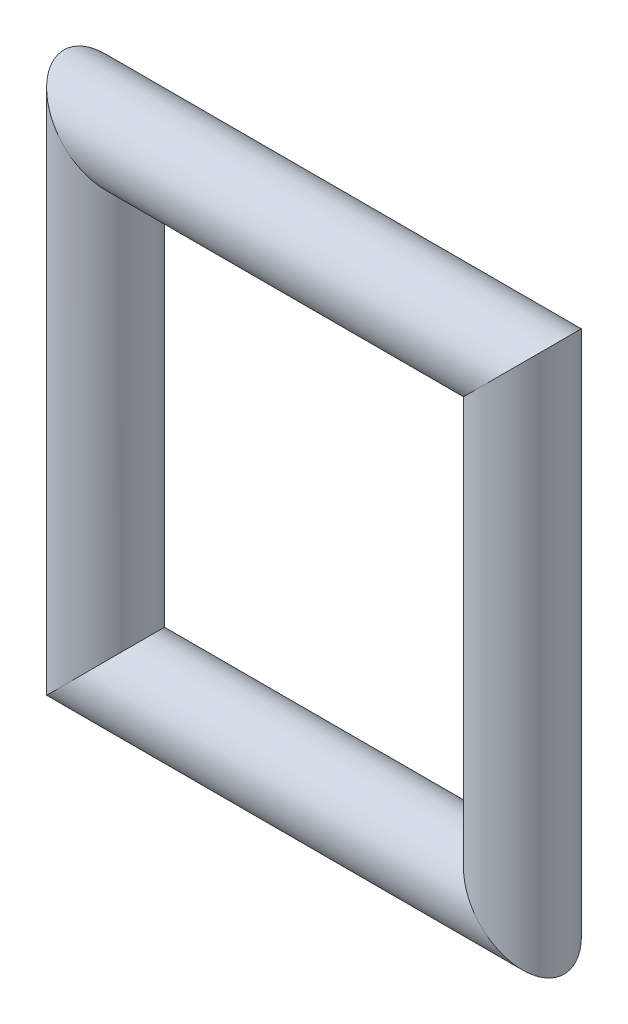
ISO-10303-21;
HEADER;
FILE_DESCRIPTION(('STEP AP214'),'2;1');
FILE_NAME('part.step','',(''),(''),'','','');
FILE_SCHEMA(('AUTOMOTIVE_DESIGN { 1 0 10303 214 1 1 1 1 }'));
ENDSEC;
DATA;
#1=APPLICATION_CONTEXT('core data for automotive mechanical design processes');
#2=APPLICATION_PROTOCOL_DEFINITION('international standard','automotive_design',2000,#1);
#3=PRODUCT_CONTEXT('',#1,'mechanical');
#4=PRODUCT('Part','Part','',(#3));
#5=PRODUCT_RELATED_PRODUCT_CATEGORY('part','',(#4));
#6=PRODUCT_DEFINITION_FORMATION('','',#4);
#7=PRODUCT_DEFINITION_CONTEXT('part definition',#1,'design');
#8=PRODUCT_DEFINITION('design','',#6,#7);
#9=PRODUCT_DEFINITION_SHAPE('','',#8);
#10=(LENGTH_UNIT() NAMED_UNIT(*) SI_UNIT(.MILLI.,.METRE.));
#11=(NAMED_UNIT(*) PLANE_ANGLE_UNIT() SI_UNIT($,.RADIAN.));
#12=(NAMED_UNIT(*) SI_UNIT($,.STERADIAN.) SOLID_ANGLE_UNIT());
#13=UNCERTAINTY_MEASURE_WITH_UNIT(LENGTH_MEASURE(1.E-05),#10,'distance_accuracy_value','');
#14=(GEOMETRIC_REPRESENTATION_CONTEXT(3) GLOBAL_UNCERTAINTY_ASSIGNED_CONTEXT((#13)) GLOBAL_UNIT_ASSIGNED_CONTEXT((#10,
#11,#12)) REPRESENTATION_CONTEXT('',''));
#15=CARTESIAN_POINT('',(0.,0.,0.));
#16=DIRECTION('',(0.,0.,1.));
#17=DIRECTION('',(1.,0.,0.));
#18=AXIS2_PLACEMENT_3D('',#15,#16,#17);
#19=CARTESIAN_POINT('',(12.5,19.6,0.));
#20=DIRECTION('',(0.,-1.,0.));
#21=DIRECTION('',(0.,0.,-1.));
#22=AXIS2_PLACEMENT_3D('',#19,#20,#21);
#23=CYLINDRICAL_SURFACE('',#22,2.5);
#24=CARTESIAN_POINT('',(12.5,14.,0.));
#25=DIRECTION('',(0.707106781186547,-0.707106781186547,0.));
#26=DIRECTION('',(0.707106781186548,0.707106781186548,0.));
#27=AXIS2_PLACEMENT_3D('',#24,#25,#26);
#28=ELLIPSE('',#27,3.53553390593274,2.5);
#29=CARTESIAN_POINT('',(15.,16.5,0.));
#30=VERTEX_POINT('',#29);
#31=EDGE_CURVE('E62',#30,#30,#28,.F.);
#32=ORIENTED_EDGE('',*,*,#31,.F.);
#33=EDGE_LOOP('',(#32));
#34=FACE_BOUND('',#33,.T.);
#35=CARTESIAN_POINT('',(12.5,-14.,0.));
#36=DIRECTION('',(-0.707106781186548,-0.707106781186548,0.));
#37=DIRECTION('',(-0.707106781186548,0.707106781186548,0.));
#38=AXIS2_PLACEMENT_3D('',#35,#36,#37);
#39=ELLIPSE('',#38,3.53553390593274,2.5);
#40=CARTESIAN_POINT('',(10.,-11.5,0.));
#41=VERTEX_POINT('',#40);
#42=EDGE_CURVE('E47',#41,#41,#39,.F.);
#43=ORIENTED_EDGE('',*,*,#42,.T.);
#44=EDGE_LOOP('',(#43));
#45=FACE_BOUND('',#44,.T.);
#46=ADVANCED_FACE('F44',(#34,#45),#23,.T.);
#47=CARTESIAN_POINT('',(18.1,-14.,0.));
#48=DIRECTION('',(-1.,0.,0.));
#49=DIRECTION('',(0.,0.,1.));
#50=AXIS2_PLACEMENT_3D('',#47,#48,#49);
#51=CYLINDRICAL_SURFACE('',#50,2.5);
#52=ORIENTED_EDGE('',*,*,#42,.F.);
#53=EDGE_LOOP('',(#52));
#54=FACE_BOUND('',#53,.T.);
#55=CARTESIAN_POINT('',(-12.5,-14.,0.));
#56=DIRECTION('',(-0.707106781186547,0.707106781186547,0.));
#57=DIRECTION('',(0.707106781186548,0.707106781186548,0.));
#58=AXIS2_PLACEMENT_3D('',#55,#56,#57);
#59=ELLIPSE('',#58,3.53553390593274,2.5);
#60=CARTESIAN_POINT('',(-10.,-11.5,0.));
#61=VERTEX_POINT('',#60);
#62=EDGE_CURVE('E52',#61,#61,#59,.F.);
#63=ORIENTED_EDGE('',*,*,#62,.T.);
#64=EDGE_LOOP('',(#63));
#65=FACE_BOUND('',#64,.T.);
#66=ADVANCED_FACE('F79',(#54,#65),#51,.T.);
#67=CARTESIAN_POINT('',(-18.1,14.,0.));
#68=DIRECTION('',(1.,0.,0.));
#69=DIRECTION('',(0.,0.,-1.));
#70=AXIS2_PLACEMENT_3D('',#67,#68,#69);
#71=CYLINDRICAL_SURFACE('',#70,2.5);
#72=CARTESIAN_POINT('',(-12.5,14.,0.));
#73=DIRECTION('',(0.707106781186547,0.707106781186547,0.));
#74=DIRECTION('',(-0.707106781186548,0.707106781186548,0.));
#75=AXIS2_PLACEMENT_3D('',#72,#73,#74);
#76=ELLIPSE('',#75,3.53553390593274,2.5);
#77=CARTESIAN_POINT('',(-15.,16.5,0.));
#78=VERTEX_POINT('',#77);
#79=EDGE_CURVE('E12',#78,#78,#76,.F.);
#80=ORIENTED_EDGE('',*,*,#79,.F.);
#81=EDGE_LOOP('',(#80));
#82=FACE_BOUND('',#81,.T.);
#83=ORIENTED_EDGE('',*,*,#31,.T.);
#84=EDGE_LOOP('',(#83));
#85=FACE_BOUND('',#84,.T.);
#86=ADVANCED_FACE('F69',(#82,#85),#71,.T.);
#87=CARTESIAN_POINT('',(-12.5,-19.6,0.));
#88=DIRECTION('',(0.,1.,0.));
#89=DIRECTION('',(0.,0.,1.));
#90=AXIS2_PLACEMENT_3D('',#87,#88,#89);
#91=CYLINDRICAL_SURFACE('',#90,2.5);
#92=ORIENTED_EDGE('',*,*,#62,.F.);
#93=EDGE_LOOP('',(#92));
#94=FACE_BOUND('',#93,.T.);
#95=ORIENTED_EDGE('',*,*,#79,.T.);
#96=EDGE_LOOP('',(#95));
#97=FACE_BOUND('',#96,.T.);
#98=ADVANCED_FACE('F72',(#94,#97),#91,.T.);
#99=CLOSED_SHELL('',(#46,#66,#86,#98));
#100=MANIFOLD_SOLID_BREP('B2',#99);
#101=ADVANCED_BREP_SHAPE_REPRESENTATION('',(#18,#100),#14);
#102=SHAPE_DEFINITION_REPRESENTATION(#9,#101);
ENDSEC;
END-ISO-10303-21;
